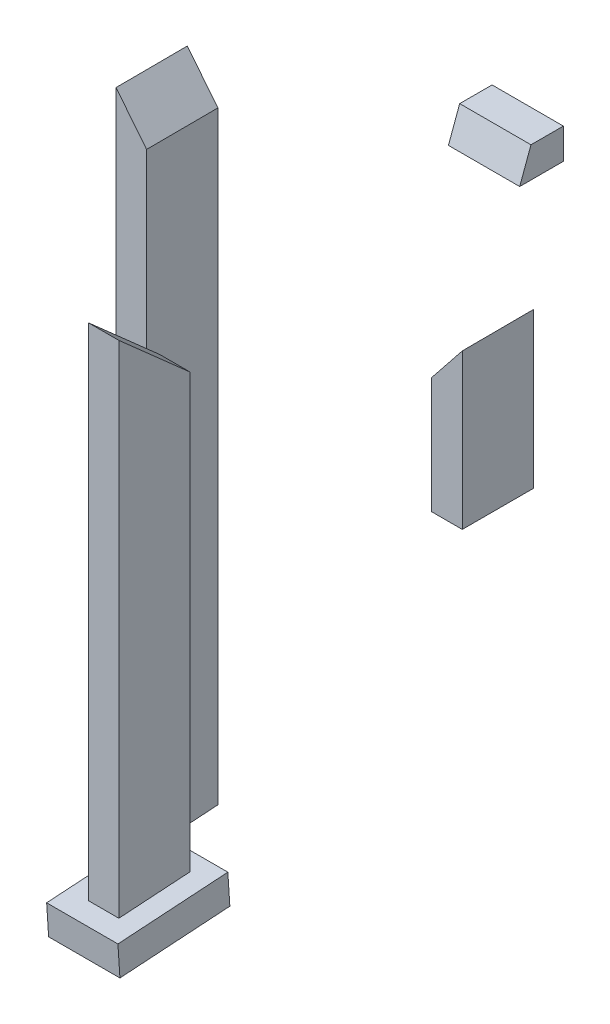
ISO-10303-21;
HEADER;
FILE_DESCRIPTION(('STEP AP214'),'2;1');
FILE_NAME('part.step','',(''),(''),'','','');
FILE_SCHEMA(('AUTOMOTIVE_DESIGN { 1 0 10303 214 1 1 1 1 }'));
ENDSEC;
DATA;
#1=APPLICATION_CONTEXT('core data for automotive mechanical design processes');
#2=APPLICATION_PROTOCOL_DEFINITION('international standard','automotive_design',2000,#1);
#3=PRODUCT_CONTEXT('',#1,'mechanical');
#4=PRODUCT('Part','Part','',(#3));
#5=PRODUCT_RELATED_PRODUCT_CATEGORY('part','',(#4));
#6=PRODUCT_DEFINITION_FORMATION('','',#4);
#7=PRODUCT_DEFINITION_CONTEXT('part definition',#1,'design');
#8=PRODUCT_DEFINITION('design','',#6,#7);
#9=PRODUCT_DEFINITION_SHAPE('','',#8);
#10=(LENGTH_UNIT() NAMED_UNIT(*) SI_UNIT(.MILLI.,.METRE.));
#11=(NAMED_UNIT(*) PLANE_ANGLE_UNIT() SI_UNIT($,.RADIAN.));
#12=(NAMED_UNIT(*) SI_UNIT($,.STERADIAN.) SOLID_ANGLE_UNIT());
#13=UNCERTAINTY_MEASURE_WITH_UNIT(LENGTH_MEASURE(1.E-05),#10,'distance_accuracy_value','');
#14=(GEOMETRIC_REPRESENTATION_CONTEXT(3) GLOBAL_UNCERTAINTY_ASSIGNED_CONTEXT((#13)) GLOBAL_UNIT_ASSIGNED_CONTEXT((#10,
#11,#12)) REPRESENTATION_CONTEXT('',''));
#15=CARTESIAN_POINT('',(0.,0.,0.));
#16=DIRECTION('',(0.,0.,1.));
#17=DIRECTION('',(1.,0.,0.));
#18=AXIS2_PLACEMENT_3D('',#15,#16,#17);
#19=CARTESIAN_POINT('',(-222.306656631324,200.54869689966,157.20965857934));
#20=DIRECTION('',(0.,0.,1.));
#21=DIRECTION('',(1.,0.,0.));
#22=AXIS2_PLACEMENT_3D('',#19,#20,#21);
#23=PLANE('',#22);
#24=DIRECTION('',(1.,0.,0.));
#25=VECTOR('',#24,1.);
#26=CARTESIAN_POINT('',(-2092.91633002723,-551.750667206393,157.20965857934));
#27=LINE('',#26,#25);
#28=CARTESIAN_POINT('',(-222.306656631323,-551.750667206399,157.209658579339));
#29=VERTEX_POINT('',#28);
#30=CARTESIAN_POINT('',(-184.206656631323,-551.7506672064,157.209658579339));
#31=VERTEX_POINT('',#30);
#32=EDGE_CURVE('E115',#29,#31,#27,.T.);
#33=ORIENTED_EDGE('',*,*,#32,.F.);
#34=DIRECTION('',(0.,-1.,0.));
#35=VECTOR('',#34,1.);
#36=CARTESIAN_POINT('',(-222.306656631324,200.54869689966,157.20965857934));
#37=LINE('',#36,#35);
#38=CARTESIAN_POINT('',(-222.306656631324,248.747832322276,157.20965857934));
#39=VERTEX_POINT('',#38);
#40=EDGE_CURVE('E183',#39,#29,#37,.T.);
#41=ORIENTED_EDGE('',*,*,#40,.F.);
#42=CARTESIAN_POINT('',(-222.306656631324,248.747832322276,157.20965857934));
#43=CARTESIAN_POINT('',(-215.956868036848,240.775979960126,157.209658579339));
#44=CARTESIAN_POINT('',(-209.606973739609,232.804211797568,157.209658579339));
#45=CARTESIAN_POINT('',(-196.906973739609,216.860843871637,157.209658579339));
#46=CARTESIAN_POINT('',(-190.556868036848,208.889244108264,157.209658579339));
#47=CARTESIAN_POINT('',(-184.206656631324,200.917728544482,157.209658579339));
#48=B_SPLINE_CURVE_WITH_KNOTS('',3,(#42,#43,#44,#45,#46,#47),.UNSPECIFIED.,.F.,.F.,(4,2,4),(0.,
30.575025871011,61.150051742022),.UNSPECIFIED.);
#49=CARTESIAN_POINT('',(-184.206656631324,200.917728544482,157.209658579339));
#50=VERTEX_POINT('',#49);
#51=EDGE_CURVE('E129',#39,#50,#48,.T.);
#52=ORIENTED_EDGE('',*,*,#51,.T.);
#53=DIRECTION('',(0.,-1.,0.));
#54=VECTOR('',#53,1.);
#55=CARTESIAN_POINT('',(-184.206656631324,200.54869689966,157.209658579339));
#56=LINE('',#55,#54);
#57=EDGE_CURVE('E166',#50,#31,#56,.T.);
#58=ORIENTED_EDGE('',*,*,#57,.T.);
#59=EDGE_LOOP('',(#33,#41,#52,#58));
#60=FACE_BOUND('',#59,.T.);
#61=ADVANCED_FACE('F68',(#60),#23,.F.);
#62=CARTESIAN_POINT('',(-34.9249999999667,31.4461867373069,256.590800000025));
#63=CARTESIAN_POINT('',(-34.9249999999667,31.4461867373069,205.079600000014));
#64=CARTESIAN_POINT('',(-34.9249999999667,31.4461867373069,153.568400000003));
#65=CARTESIAN_POINT('',(-34.9249999999667,31.4461867373069,102.057199999991));
#66=CARTESIAN_POINT('',(-123.161237840438,141.512853403974,349.089470571912));
#67=CARTESIAN_POINT('',(-122.942907620531,141.512853403974,263.762224842528));
#68=CARTESIAN_POINT('',(-122.724577400624,141.512853403974,178.434979113144));
#69=CARTESIAN_POINT('',(-122.506247180717,141.512853403974,93.1077333837597));
#70=CARTESIAN_POINT('',(-211.39747568091,251.57952007064,441.588141143798));
#71=CARTESIAN_POINT('',(-210.960815241096,251.57952007064,322.444849685041));
#72=CARTESIAN_POINT('',(-210.524154801282,251.57952007064,203.301558226285));
#73=CARTESIAN_POINT('',(-210.087494361468,251.57952007064,84.158266767528));
#74=CARTESIAN_POINT('',(-299.633713521381,361.646186737307,534.086811715685));
#75=CARTESIAN_POINT('',(-298.97872286166,361.646186737307,381.127474527555));
#76=CARTESIAN_POINT('',(-298.32373220194,361.646186737307,228.168137339426));
#77=CARTESIAN_POINT('',(-297.668741542219,361.646186737307,75.2088001512964));
#78=B_SPLINE_SURFACE_WITH_KNOTS('',3,3,((#62,#63,#64,#65),(#66,#67,#68,#69),(#70,#71,#72,#73),
(#74,#75,#76,#77)),.UNSPECIFIED.,.F.,.F.,.F.,(4,4),(4,4),(0.,1.),(0.,1.),.UNSPECIFIED.);
#79=OFFSET_SURFACE('',#78,11.1125,.F.);
#80=CARTESIAN_POINT('',(-184.206656631324,200.917728544482,157.209658579339));
#81=CARTESIAN_POINT('',(-184.206656631323,200.856161391934,172.026324986586));
#82=CARTESIAN_POINT('',(-184.206656631323,200.794625486928,186.842991523543));
#83=CARTESIAN_POINT('',(-184.206656631323,200.671616171997,216.476324856876));
#84=CARTESIAN_POINT('',(-184.206656631323,200.610142762073,231.292991653253));
#85=CARTESIAN_POINT('',(-184.206656631323,200.54870059969,246.109658579339));
#86=B_SPLINE_CURVE_WITH_KNOTS('',3,(#80,#81,#82,#83,#84,#85),.UNSPECIFIED.,.F.,.F.,(4,2,4),(0.,
44.4503829613964,88.9007659227928),.UNSPECIFIED.);
#87=CARTESIAN_POINT('',(-184.206656631323,200.54869689966,246.109658579339));
#88=VERTEX_POINT('',#87);
#89=EDGE_CURVE('E84',#50,#88,#86,.T.);
#90=ORIENTED_EDGE('',*,*,#89,.F.);
#91=ORIENTED_EDGE('',*,*,#51,.F.);
#92=CARTESIAN_POINT('',(-222.306656631323,248.33585439845,246.10965857934));
#93=CARTESIAN_POINT('',(-222.306656631323,248.404463499938,231.292991662957));
#94=CARTESIAN_POINT('',(-222.306656631323,248.473099544334,216.476324871432));
#95=CARTESIAN_POINT('',(-222.306656631323,248.610425518942,186.842991538099));
#96=CARTESIAN_POINT('',(-222.306656631324,248.679115449155,172.02632499629));
#97=CARTESIAN_POINT('',(-222.306656631324,248.747832322276,157.20965857934));
#98=B_SPLINE_CURVE_WITH_KNOTS('',3,(#92,#93,#94,#95,#96,#97),.UNSPECIFIED.,.F.,.F.,(4,2,4),(0.,
44.450477291689,88.9009545833781),.UNSPECIFIED.);
#99=CARTESIAN_POINT('',(-222.306656631323,248.33585439845,246.10965857934));
#100=VERTEX_POINT('',#99);
#101=EDGE_CURVE('E89',#100,#39,#98,.T.);
#102=ORIENTED_EDGE('',*,*,#101,.F.);
#103=CARTESIAN_POINT('',(-184.206656631323,200.54870059969,246.109658579339));
#104=CARTESIAN_POINT('',(-187.382011407271,204.530680547151,246.109658579339));
#105=CARTESIAN_POINT('',(-190.557265912773,208.512740451931,246.109658579339));
#106=CARTESIAN_POINT('',(-196.9075921368,216.477005996019,246.109658579339));
#107=CARTESIAN_POINT('',(-200.082663855326,220.459211635327,246.109658579339));
#108=CARTESIAN_POINT('',(-206.432642270092,228.423754481869,246.109658579339));
#109=CARTESIAN_POINT('',(-209.607548966333,232.406091689103,246.109658579339));
#110=CARTESIAN_POINT('',(-215.95721195245,240.370886021439,246.10965857934));
#111=CARTESIAN_POINT('',(-219.131968242326,244.35334314654,246.10965857934));
#112=CARTESIAN_POINT('',(-222.306656631323,248.33585439845,246.10965857934));
#113=B_SPLINE_CURVE_WITH_KNOTS('',3,(#103,#104,#105,#106,#107,#108,#109,#110,#111,#112),
.UNSPECIFIED.,.F.,.F.,(4,2,2,2,4),(0.,15.2791158185484,30.5582316105244,45.837347401201,
61.11646321845),.UNSPECIFIED.);
#114=EDGE_CURVE('E77',#88,#100,#113,.T.);
#115=ORIENTED_EDGE('',*,*,#114,.F.);
#116=EDGE_LOOP('',(#90,#91,#102,#115));
#117=FACE_BOUND('',#116,.T.);
#118=ADVANCED_FACE('F145',(#117),#79,.F.);
#119=CARTESIAN_POINT('',(-222.306656631323,200.54869689966,246.10965857934));
#120=DIRECTION('',(0.,0.,-1.));
#121=DIRECTION('',(-1.,0.,0.));
#122=AXIS2_PLACEMENT_3D('',#119,#120,#121);
#123=PLANE('',#122);
#124=DIRECTION('',(0.,-1.,0.));
#125=VECTOR('',#124,1.);
#126=CARTESIAN_POINT('',(-222.306656631323,200.54869689966,246.10965857934));
#127=LINE('',#126,#125);
#128=CARTESIAN_POINT('',(-222.306656631323,-557.574330308004,246.10965857934));
#129=VERTEX_POINT('',#128);
#130=EDGE_CURVE('E122',#100,#129,#127,.T.);
#131=ORIENTED_EDGE('',*,*,#130,.T.);
#132=DIRECTION('',(1.,0.,0.));
#133=VECTOR('',#132,1.);
#134=CARTESIAN_POINT('',(-222.306656631323,-557.574330308004,246.10965857934));
#135=LINE('',#134,#133);
#136=CARTESIAN_POINT('',(-184.206656631323,-557.574330308004,246.109658579339));
#137=VERTEX_POINT('',#136);
#138=EDGE_CURVE('E113',#129,#137,#135,.T.);
#139=ORIENTED_EDGE('',*,*,#138,.T.);
#140=DIRECTION('',(0.,-1.,0.));
#141=VECTOR('',#140,1.);
#142=CARTESIAN_POINT('',(-184.206656631323,200.54869689966,246.109658579339));
#143=LINE('',#142,#141);
#144=EDGE_CURVE('E119',#88,#137,#143,.T.);
#145=ORIENTED_EDGE('',*,*,#144,.F.);
#146=ORIENTED_EDGE('',*,*,#114,.T.);
#147=EDGE_LOOP('',(#131,#139,#145,#146));
#148=FACE_BOUND('',#147,.T.);
#149=ADVANCED_FACE('F70',(#148),#123,.F.);
#150=CARTESIAN_POINT('',(-184.206656631323,200.54869689966,246.109658579339));
#151=DIRECTION('',(-1.,0.,0.));
#152=DIRECTION('',(0.,0.,1.));
#153=AXIS2_PLACEMENT_3D('',#150,#151,#152);
#154=PLANE('',#153);
#155=ORIENTED_EDGE('',*,*,#144,.T.);
#156=DIRECTION('',(0.,0.0653679148444953,-0.997861230687355));
#157=VECTOR('',#156,1.);
#158=CARTESIAN_POINT('',(-184.206656631323,-554.334897684472,196.658727918077));
#159=LINE('',#158,#157);
#160=EDGE_CURVE('E109',#137,#31,#159,.T.);
#161=ORIENTED_EDGE('',*,*,#160,.T.);
#162=ORIENTED_EDGE('',*,*,#57,.F.);
#163=ORIENTED_EDGE('',*,*,#89,.T.);
#164=EDGE_LOOP('',(#155,#161,#162,#163));
#165=FACE_BOUND('',#164,.T.);
#166=ADVANCED_FACE('F120',(#165),#154,.F.);
#167=CARTESIAN_POINT('',(-222.306656631323,200.54869689966,246.10965857934));
#168=DIRECTION('',(1.,0.,0.));
#169=DIRECTION('',(0.,0.,-1.));
#170=AXIS2_PLACEMENT_3D('',#167,#168,#169);
#171=PLANE('',#170);
#172=ORIENTED_EDGE('',*,*,#40,.T.);
#173=DIRECTION('',(0.,-0.0653679148444953,0.997861230687355));
#174=VECTOR('',#173,1.);
#175=CARTESIAN_POINT('',(-222.306656631323,-554.334897684472,196.658727918077));
#176=LINE('',#175,#174);
#177=EDGE_CURVE('E13',#29,#129,#176,.T.);
#178=ORIENTED_EDGE('',*,*,#177,.T.);
#179=ORIENTED_EDGE('',*,*,#130,.F.);
#180=ORIENTED_EDGE('',*,*,#101,.T.);
#181=EDGE_LOOP('',(#172,#178,#179,#180));
#182=FACE_BOUND('',#181,.T.);
#183=ADVANCED_FACE('F168',(#182),#171,.F.);
#184=CARTESIAN_POINT('',(-2092.91633002723,-551.750667206393,157.20965857934));
#185=DIRECTION('',(0.,0.997861230687355,0.0653679148444953));
#186=DIRECTION('',(0.,-0.0653679148444953,0.997861230687355));
#187=AXIS2_PLACEMENT_3D('',#184,#185,#186);
#188=PLANE('',#187);
#189=ORIENTED_EDGE('',*,*,#160,.F.);
#190=ORIENTED_EDGE('',*,*,#138,.F.);
#191=ORIENTED_EDGE('',*,*,#177,.F.);
#192=ORIENTED_EDGE('',*,*,#32,.T.);
#193=EDGE_LOOP('',(#189,#190,#191,#192));
#194=FACE_BOUND('',#193,.T.);
#195=ADVANCED_FACE('F111',(#194),#188,.F.);
#196=CLOSED_SHELL('',(#61,#118,#149,#166,#183,#195));
#197=MANIFOLD_SOLID_BREP('B2',#196);
#198=CARTESIAN_POINT('',(252.903016686654,361.646186737307,-19.6341999999748));
#199=CARTESIAN_POINT('',(197.139240036872,251.57952007064,20.9296000000139));
#200=CARTESIAN_POINT('',(141.37546338709,141.512853403974,61.4934000000026));
#201=CARTESIAN_POINT('',(85.6116867373077,31.4461867373069,102.057199999991));
#202=CARTESIAN_POINT('',(101.196567808001,361.646186737307,-19.6341999999748));
#203=CARTESIAN_POINT('',(82.6086422580725,251.57952007064,20.9296000000139));
#204=CARTESIAN_POINT('',(64.0207167081444,141.512853403974,61.4934000000026));
#205=CARTESIAN_POINT('',(45.4327911582163,31.4461867373069,102.057199999991));
#206=CARTESIAN_POINT('',(-50.5098810706527,361.646186737307,-19.6341999999748));
#207=CARTESIAN_POINT('',(-31.9219555207268,251.57952007064,20.9296000000139));
#208=CARTESIAN_POINT('',(-13.334029970801,141.512853403974,61.4934000000026));
#209=CARTESIAN_POINT('',(5.25389557912479,31.4461867373069,102.057199999991));
#210=CARTESIAN_POINT('',(-202.216329949306,361.646186737307,-19.6341999999748));
#211=CARTESIAN_POINT('',(-146.452553299526,251.57952007064,20.9296000000139));
#212=CARTESIAN_POINT('',(-90.6887766497464,141.512853403974,61.4934000000027));
#213=CARTESIAN_POINT('',(-34.9249999999667,31.4461867373069,102.057199999991));
#214=B_SPLINE_SURFACE_WITH_KNOTS('',3,3,((#198,#199,#200,#201),(#202,#203,#204,#205),(#206,#207,
#208,#209),(#210,#211,#212,#213)),.UNSPECIFIED.,.F.,.F.,.F.,(4,4),(4,4),(0.,1.),(0.,1.),.UNSPECIFIED.);
#215=OFFSET_SURFACE('',#214,-11.1125,.F.);
#216=CARTESIAN_POINT('',(-19.1066566313261,219.904002665549,20.7601124284216));
#217=CARTESIAN_POINT('',(-19.1066566313261,207.204002665549,25.4405508899587));
#218=CARTESIAN_POINT('',(-19.1066566313261,194.504002665549,30.1209893514959));
#219=CARTESIAN_POINT('',(-19.1066566313261,181.804002665549,34.8014278130331));
#220=B_SPLINE_CURVE_WITH_KNOTS('',3,(#216,#217,#218,#219),.UNSPECIFIED.,.F.,.F.,(4,4),(0.,
40.6050309411301),.UNSPECIFIED.);
#221=CARTESIAN_POINT('',(-19.1066566313261,219.904002665549,20.7601124284216));
#222=VERTEX_POINT('',#221);
#223=CARTESIAN_POINT('',(-19.1066566313261,181.804002665549,34.8014278130331));
#224=VERTEX_POINT('',#223);
#225=EDGE_CURVE('E260',#222,#224,#220,.T.);
#226=ORIENTED_EDGE('',*,*,#225,.T.);
#227=CARTESIAN_POINT('',(-19.1066566313262,181.804002665549,34.8014278130331));
#228=CARTESIAN_POINT('',(10.5266767020074,181.804002665549,34.8014278130331));
#229=CARTESIAN_POINT('',(40.1600100353409,181.804002665549,34.8014278130331));
#230=CARTESIAN_POINT('',(69.7933433686745,181.804002665549,34.8014278130331));
#231=B_SPLINE_CURVE_WITH_KNOTS('',3,(#227,#228,#229,#230),.UNSPECIFIED.,.F.,.F.,(4,4),(0.,
88.9000000000008),.UNSPECIFIED.);
#232=CARTESIAN_POINT('',(69.7933433686745,181.804002665549,34.8014278130331));
#233=VERTEX_POINT('',#232);
#234=EDGE_CURVE('E66',#224,#233,#231,.T.);
#235=ORIENTED_EDGE('',*,*,#234,.T.);
#236=CARTESIAN_POINT('',(69.7933433686739,181.804002665549,34.8014278130331));
#237=CARTESIAN_POINT('',(69.7933433686739,194.504002665549,30.1209893514959));
#238=CARTESIAN_POINT('',(69.7933433686739,207.204002665549,25.4405508899588));
#239=CARTESIAN_POINT('',(69.7933433686739,219.904002665549,20.7601124284216));
#240=B_SPLINE_CURVE_WITH_KNOTS('',3,(#236,#237,#238,#239),.UNSPECIFIED.,.F.,.F.,(4,4),(0.,
40.6050309411301),.UNSPECIFIED.);
#241=CARTESIAN_POINT('',(69.7933433686739,219.904002665549,20.7601124284216));
#242=VERTEX_POINT('',#241);
#243=EDGE_CURVE('E297',#233,#242,#240,.T.);
#244=ORIENTED_EDGE('',*,*,#243,.T.);
#245=CARTESIAN_POINT('',(69.7933433686745,219.904002665549,20.7601124284216));
#246=CARTESIAN_POINT('',(40.160010035341,219.904002665549,20.7601124284216));
#247=CARTESIAN_POINT('',(10.5266767020074,219.904002665549,20.7601124284216));
#248=CARTESIAN_POINT('',(-19.1066566313262,219.904002665549,20.7601124284216));
#249=B_SPLINE_CURVE_WITH_KNOTS('',3,(#245,#246,#247,#248),.UNSPECIFIED.,.F.,.F.,(4,4),(0.,
88.9000000000008),.UNSPECIFIED.);
#250=EDGE_CURVE('E303',#242,#222,#249,.T.);
#251=ORIENTED_EDGE('',*,*,#250,.T.);
#252=EDGE_LOOP('',(#226,#235,#244,#251));
#253=FACE_BOUND('',#252,.T.);
#254=ADVANCED_FACE('F245',(#253),#215,.T.);
#255=CARTESIAN_POINT('',(-19.1066566313261,181.804002665549,-19.6341999999748));
#256=DIRECTION('',(0.,1.,0.));
#257=DIRECTION('',(0.,0.,1.));
#258=AXIS2_PLACEMENT_3D('',#255,#256,#257);
#259=PLANE('',#258);
#260=DIRECTION('',(0.,0.,1.));
#261=VECTOR('',#260,1.);
#262=CARTESIAN_POINT('',(-19.1066566313261,181.804002665549,-19.6341999999748));
#263=LINE('',#262,#261);
#264=CARTESIAN_POINT('',(-19.1066566313261,181.804002665549,-19.6341999999748));
#265=VERTEX_POINT('',#264);
#266=EDGE_CURVE('E274',#265,#224,#263,.T.);
#267=ORIENTED_EDGE('',*,*,#266,.F.);
#268=DIRECTION('',(-1.,0.,0.));
#269=VECTOR('',#268,1.);
#270=CARTESIAN_POINT('',(-19.1066566313261,181.804002665549,-19.6341999999748));
#271=LINE('',#270,#269);
#272=CARTESIAN_POINT('',(69.7933433686739,181.804002665549,-19.6341999999748));
#273=VERTEX_POINT('',#272);
#274=EDGE_CURVE('E299',#273,#265,#271,.T.);
#275=ORIENTED_EDGE('',*,*,#274,.F.);
#276=DIRECTION('',(0.,0.,1.));
#277=VECTOR('',#276,1.);
#278=CARTESIAN_POINT('',(69.7933433686739,181.804002665549,-19.6341999999748));
#279=LINE('',#278,#277);
#280=EDGE_CURVE('E267',#273,#233,#279,.T.);
#281=ORIENTED_EDGE('',*,*,#280,.T.);
#282=ORIENTED_EDGE('',*,*,#234,.F.);
#283=EDGE_LOOP('',(#267,#275,#281,#282));
#284=FACE_BOUND('',#283,.T.);
#285=ADVANCED_FACE('F300',(#284),#259,.F.);
#286=CARTESIAN_POINT('',(69.7933433686739,181.804002665549,-19.6341999999748));
#287=DIRECTION('',(-1.,0.,0.));
#288=DIRECTION('',(0.,0.,1.));
#289=AXIS2_PLACEMENT_3D('',#286,#287,#288);
#290=PLANE('',#289);
#291=ORIENTED_EDGE('',*,*,#280,.F.);
#292=DIRECTION('',(0.,-1.,0.));
#293=VECTOR('',#292,1.);
#294=CARTESIAN_POINT('',(69.7933433686739,181.804002665549,-19.6341999999748));
#295=LINE('',#294,#293);
#296=CARTESIAN_POINT('',(69.7933433686739,219.904002665549,-19.6341999999748));
#297=VERTEX_POINT('',#296);
#298=EDGE_CURVE('E295',#297,#273,#295,.T.);
#299=ORIENTED_EDGE('',*,*,#298,.F.);
#300=DIRECTION('',(0.,0.,1.));
#301=VECTOR('',#300,1.);
#302=CARTESIAN_POINT('',(69.7933433686739,219.904002665549,-19.6341999999748));
#303=LINE('',#302,#301);
#304=EDGE_CURVE('E314',#297,#242,#303,.T.);
#305=ORIENTED_EDGE('',*,*,#304,.T.);
#306=ORIENTED_EDGE('',*,*,#243,.F.);
#307=EDGE_LOOP('',(#291,#299,#305,#306));
#308=FACE_BOUND('',#307,.T.);
#309=ADVANCED_FACE('F292',(#308),#290,.F.);
#310=CARTESIAN_POINT('',(-19.1066566313261,181.804002665549,-19.6341999999748));
#311=DIRECTION('',(1.,0.,0.));
#312=DIRECTION('',(0.,1.,0.));
#313=AXIS2_PLACEMENT_3D('',#310,#311,#312);
#314=PLANE('',#313);
#315=ORIENTED_EDGE('',*,*,#225,.F.);
#316=DIRECTION('',(0.,0.,1.));
#317=VECTOR('',#316,1.);
#318=CARTESIAN_POINT('',(-19.1066566313261,219.904002665549,-19.6341999999748));
#319=LINE('',#318,#317);
#320=CARTESIAN_POINT('',(-19.1066566313261,219.904002665549,-19.6341999999748));
#321=VERTEX_POINT('',#320);
#322=EDGE_CURVE('E316',#321,#222,#319,.T.);
#323=ORIENTED_EDGE('',*,*,#322,.F.);
#324=DIRECTION('',(0.,1.,0.));
#325=VECTOR('',#324,1.);
#326=CARTESIAN_POINT('',(-19.1066566313261,181.804002665549,-19.6341999999748));
#327=LINE('',#326,#325);
#328=EDGE_CURVE('E309',#265,#321,#327,.T.);
#329=ORIENTED_EDGE('',*,*,#328,.F.);
#330=ORIENTED_EDGE('',*,*,#266,.T.);
#331=EDGE_LOOP('',(#315,#323,#329,#330));
#332=FACE_BOUND('',#331,.T.);
#333=ADVANCED_FACE('F247',(#332),#314,.F.);
#334=CARTESIAN_POINT('',(0.,0.,-19.6341999999748));
#335=DIRECTION('',(0.,0.,-1.));
#336=DIRECTION('',(-1.,0.,0.));
#337=AXIS2_PLACEMENT_3D('',#334,#335,#336);
#338=PLANE('',#337);
#339=ORIENTED_EDGE('',*,*,#328,.T.);
#340=DIRECTION('',(1.,0.,0.));
#341=VECTOR('',#340,1.);
#342=CARTESIAN_POINT('',(-19.1066566313261,219.904002665549,-19.6341999999748));
#343=LINE('',#342,#341);
#344=EDGE_CURVE('E307',#321,#297,#343,.T.);
#345=ORIENTED_EDGE('',*,*,#344,.T.);
#346=ORIENTED_EDGE('',*,*,#298,.T.);
#347=ORIENTED_EDGE('',*,*,#274,.T.);
#348=EDGE_LOOP('',(#339,#345,#346,#347));
#349=FACE_BOUND('',#348,.T.);
#350=ADVANCED_FACE('F306',(#349),#338,.T.);
#351=CARTESIAN_POINT('',(-19.1066566313261,219.904002665549,-19.6341999999748));
#352=DIRECTION('',(0.,-1.,0.));
#353=DIRECTION('',(0.,0.,-1.));
#354=AXIS2_PLACEMENT_3D('',#351,#352,#353);
#355=PLANE('',#354);
#356=ORIENTED_EDGE('',*,*,#344,.F.);
#357=ORIENTED_EDGE('',*,*,#322,.T.);
#358=ORIENTED_EDGE('',*,*,#250,.F.);
#359=ORIENTED_EDGE('',*,*,#304,.F.);
#360=EDGE_LOOP('',(#356,#357,#358,#359));
#361=FACE_BOUND('',#360,.T.);
#362=ADVANCED_FACE('F347',(#361),#355,.F.);
#363=CLOSED_SHELL('',(#254,#285,#309,#333,#350,#362));
#364=MANIFOLD_SOLID_BREP('B7',#363);
#365=CARTESIAN_POINT('',(85.6116867373077,31.4461867373069,256.590800000025));
#366=CARTESIAN_POINT('',(85.6116867373077,31.4461867373069,205.079600000014));
#367=CARTESIAN_POINT('',(85.6116867373077,31.4461867373069,153.568400000003));
#368=CARTESIAN_POINT('',(85.6116867373077,31.4461867373069,102.057199999991));
#369=CARTESIAN_POINT('',(173.847924577782,141.512853403974,349.089470571912));
#370=CARTESIAN_POINT('',(173.629594357875,141.512853403974,263.762224842528));
#371=CARTESIAN_POINT('',(173.411264137968,141.512853403974,178.434979113144));
#372=CARTESIAN_POINT('',(173.192933918061,141.512853403974,93.1077333837597));
#373=CARTESIAN_POINT('',(262.084162418256,251.57952007064,441.588141143798));
#374=CARTESIAN_POINT('',(261.647501978442,251.57952007064,322.444849685041));
#375=CARTESIAN_POINT('',(261.210841538628,251.57952007064,203.301558226285));
#376=CARTESIAN_POINT('',(260.774181098814,251.57952007064,84.158266767528));
#377=CARTESIAN_POINT('',(350.320400258729,361.646186737307,534.086811715685));
#378=CARTESIAN_POINT('',(349.665409599009,361.646186737307,381.127474527555));
#379=CARTESIAN_POINT('',(349.010418939288,361.646186737307,228.168137339426));
#380=CARTESIAN_POINT('',(348.355428279567,361.646186737307,75.2088001512963));
#381=B_SPLINE_SURFACE_WITH_KNOTS('',3,3,((#365,#366,#367,#368),(#369,#370,#371,#372),(#373,#374,
#375,#376),(#377,#378,#379,#380)),.UNSPECIFIED.,.F.,.F.,.F.,(4,4),(4,4),(0.,1.),(0.,1.),.UNSPECIFIED.);
#382=OFFSET_SURFACE('',#381,-11.1125,.F.);
#383=CARTESIAN_POINT('',(253.943358182125,224.244581573542,290.555904464682));
#384=CARTESIAN_POINT('',(253.943358182125,224.309781460416,275.739237542111));
#385=CARTESIAN_POINT('',(253.943358182125,224.375010398489,260.922570747493));
#386=CARTESIAN_POINT('',(253.943358182125,224.50552637703,231.289237414159));
#387=CARTESIAN_POINT('',(253.943358182125,224.570813417499,216.472570875445));
#388=CARTESIAN_POINT('',(253.943358182125,224.636129509166,201.655904464682));
#389=B_SPLINE_CURVE_WITH_KNOTS('',3,(#383,#384,#385,#386,#387,#388),.UNSPECIFIED.,.F.,.F.,(4,2,
4),(0.,44.4504311278762,88.9008622557524),.UNSPECIFIED.);
#390=CARTESIAN_POINT('',(253.943358182125,224.244581573542,290.555904464682));
#391=VERTEX_POINT('',#390);
#392=CARTESIAN_POINT('',(253.943358182126,224.636129509166,201.655904464682));
#393=VERTEX_POINT('',#392);
#394=EDGE_CURVE('E434',#391,#393,#389,.T.);
#395=ORIENTED_EDGE('',*,*,#394,.T.);
#396=CARTESIAN_POINT('',(253.943358182126,224.636129509166,201.655904464682));
#397=CARTESIAN_POINT('',(250.76860835943,220.652375778616,201.655904464682));
#398=CARTESIAN_POINT('',(247.593804572842,216.668665052599,201.655904464682));
#399=CARTESIAN_POINT('',(241.244076567446,208.701339589024,201.655904464682));
#400=CARTESIAN_POINT('',(238.06915234864,204.717724851466,201.655904464682));
#401=CARTESIAN_POINT('',(231.719170967013,196.750601334964,201.655904464682));
#402=CARTESIAN_POINT('',(228.544113804192,192.767092556021,201.655904464682));
#403=CARTESIAN_POINT('',(222.193851116979,184.800193247092,201.655904464682));
#404=CARTESIAN_POINT('',(219.018645592587,180.816802717107,201.655904464682));
#405=CARTESIAN_POINT('',(215.843358182126,176.833477461157,201.655904464682));
#406=B_SPLINE_CURVE_WITH_KNOTS('',3,(#396,#397,#398,#399,#400,#401,#402,#403,#404,#405),
.UNSPECIFIED.,.F.,.F.,(4,2,2,2,4),(0.,15.2821455302468,30.5642910432239,45.8464365571047,
61.1285820882552),.UNSPECIFIED.);
#407=CARTESIAN_POINT('',(215.843358182126,176.833477461157,201.655904464682));
#408=VERTEX_POINT('',#407);
#409=EDGE_CURVE('E243',#393,#408,#406,.T.);
#410=ORIENTED_EDGE('',*,*,#409,.T.);
#411=CARTESIAN_POINT('',(215.843358182126,176.833477461157,201.655904464682));
#412=CARTESIAN_POINT('',(215.843358182125,176.776352405739,216.472570873645));
#413=CARTESIAN_POINT('',(215.843358182125,176.719260810153,231.28923741146));
#414=CARTESIAN_POINT('',(215.843358182125,176.605144538642,260.922570744793));
#415=CARTESIAN_POINT('',(215.843358182125,176.548119862718,275.739237540311));
#416=CARTESIAN_POINT('',(215.843358182125,176.491128646625,290.555904464682));
#417=B_SPLINE_CURVE_WITH_KNOTS('',3,(#411,#412,#413,#414,#415,#416),.UNSPECIFIED.,.F.,.F.,(4,2,
4),(0.,44.4503295903168,88.9006591806334),.UNSPECIFIED.);
#418=CARTESIAN_POINT('',(215.843358182125,176.491128646626,290.555904464682));
#419=VERTEX_POINT('',#418);
#420=EDGE_CURVE('E476',#408,#419,#417,.T.);
#421=ORIENTED_EDGE('',*,*,#420,.T.);
#422=CARTESIAN_POINT('',(215.843358182125,176.491128646625,290.555904464682));
#423=CARTESIAN_POINT('',(219.018942884543,180.47011652236,290.555904464682));
#424=CARTESIAN_POINT('',(222.19436102202,184.449237327412,290.555904464682));
#425=CARTESIAN_POINT('',(228.544895476358,192.4077197478,290.555904464682));
#426=CARTESIAN_POINT('',(231.720011793222,196.387081363135,290.555904464682));
#427=CARTESIAN_POINT('',(238.069973944593,204.346020392066,290.555904464682));
#428=CARTESIAN_POINT('',(241.2448197791,208.325597805662,290.555904464682));
#429=CARTESIAN_POINT('',(247.594266407887,216.284948140795,290.555904464682));
#430=CARTESIAN_POINT('',(250.768867202166,220.264721062333,290.555904464682));
#431=CARTESIAN_POINT('',(253.943358182125,224.244581573542,290.555904464682));
#432=B_SPLINE_CURVE_WITH_KNOTS('',3,(#422,#423,#424,#425,#426,#427,#428,#429,#430,#431),
.UNSPECIFIED.,.F.,.F.,(4,2,2,2,4),(0.,15.2725290693702,30.5450580671539,45.8175870611944,
61.0901161268213),.UNSPECIFIED.);
#433=EDGE_CURVE('E471',#419,#391,#432,.T.);
#434=ORIENTED_EDGE('',*,*,#433,.T.);
#435=EDGE_LOOP('',(#395,#410,#421,#434));
#436=FACE_BOUND('',#435,.T.);
#437=ADVANCED_FACE('F424',(#436),#382,.T.);
#438=CARTESIAN_POINT('',(215.843358182125,31.4461867373068,290.555904464682));
#439=DIRECTION('',(0.,0.,-1.));
#440=DIRECTION('',(-1.,0.,0.));
#441=AXIS2_PLACEMENT_3D('',#438,#439,#440);
#442=PLANE('',#441);
#443=ORIENTED_EDGE('',*,*,#433,.F.);
#444=DIRECTION('',(0.,1.,0.));
#445=VECTOR('',#444,1.);
#446=CARTESIAN_POINT('',(215.843358182125,31.4461867373068,290.555904464682));
#447=LINE('',#446,#445);
#448=CARTESIAN_POINT('',(215.843358182125,31.4461867373068,290.555904464682));
#449=VERTEX_POINT('',#448);
#450=EDGE_CURVE('E465',#449,#419,#447,.T.);
#451=ORIENTED_EDGE('',*,*,#450,.F.);
#452=DIRECTION('',(-1.,0.,0.));
#453=VECTOR('',#452,1.);
#454=CARTESIAN_POINT('',(215.843358182125,31.4461867373068,290.555904464682));
#455=LINE('',#454,#453);
#456=CARTESIAN_POINT('',(253.943358182125,31.4461867373068,290.555904464682));
#457=VERTEX_POINT('',#456);
#458=EDGE_CURVE('E469',#457,#449,#455,.T.);
#459=ORIENTED_EDGE('',*,*,#458,.F.);
#460=DIRECTION('',(0.,1.,0.));
#461=VECTOR('',#460,1.);
#462=CARTESIAN_POINT('',(253.943358182125,31.4461867373068,290.555904464682));
#463=LINE('',#462,#461);
#464=EDGE_CURVE('E449',#457,#391,#463,.T.);
#465=ORIENTED_EDGE('',*,*,#464,.T.);
#466=EDGE_LOOP('',(#443,#451,#459,#465));
#467=FACE_BOUND('',#466,.T.);
#468=ADVANCED_FACE('F467',(#467),#442,.F.);
#469=CARTESIAN_POINT('',(253.943358182126,31.4461867373068,201.655904464682));
#470=DIRECTION('',(-1.,0.,0.));
#471=DIRECTION('',(0.,0.,1.));
#472=AXIS2_PLACEMENT_3D('',#469,#470,#471);
#473=PLANE('',#472);
#474=ORIENTED_EDGE('',*,*,#464,.F.);
#475=DIRECTION('',(0.,0.,1.));
#476=VECTOR('',#475,1.);
#477=CARTESIAN_POINT('',(253.943358182126,31.4461867373068,201.655904464682));
#478=LINE('',#477,#476);
#479=CARTESIAN_POINT('',(253.943358182126,31.4461867373068,201.655904464682));
#480=VERTEX_POINT('',#479);
#481=EDGE_CURVE('E487',#480,#457,#478,.T.);
#482=ORIENTED_EDGE('',*,*,#481,.F.);
#483=DIRECTION('',(0.,1.,0.));
#484=VECTOR('',#483,1.);
#485=CARTESIAN_POINT('',(253.943358182126,31.4461867373068,201.655904464682));
#486=LINE('',#485,#484);
#487=EDGE_CURVE('E429',#480,#393,#486,.T.);
#488=ORIENTED_EDGE('',*,*,#487,.T.);
#489=ORIENTED_EDGE('',*,*,#394,.F.);
#490=EDGE_LOOP('',(#474,#482,#488,#489));
#491=FACE_BOUND('',#490,.T.);
#492=ADVANCED_FACE('F535',(#491),#473,.F.);
#493=CARTESIAN_POINT('',(215.843358182126,31.4461867373068,201.655904464682));
#494=DIRECTION('',(0.,0.,1.));
#495=DIRECTION('',(1.,0.,0.));
#496=AXIS2_PLACEMENT_3D('',#493,#494,#495);
#497=PLANE('',#496);
#498=ORIENTED_EDGE('',*,*,#487,.F.);
#499=DIRECTION('',(1.,0.,0.));
#500=VECTOR('',#499,1.);
#501=CARTESIAN_POINT('',(215.843358182126,31.4461867373068,201.655904464682));
#502=LINE('',#501,#500);
#503=CARTESIAN_POINT('',(215.843358182126,31.4461867373068,201.655904464682));
#504=VERTEX_POINT('',#503);
#505=EDGE_CURVE('E489',#504,#480,#502,.T.);
#506=ORIENTED_EDGE('',*,*,#505,.F.);
#507=DIRECTION('',(0.,1.,0.));
#508=VECTOR('',#507,1.);
#509=CARTESIAN_POINT('',(215.843358182126,31.4461867373068,201.655904464682));
#510=LINE('',#509,#508);
#511=EDGE_CURVE('E475',#504,#408,#510,.T.);
#512=ORIENTED_EDGE('',*,*,#511,.T.);
#513=ORIENTED_EDGE('',*,*,#409,.F.);
#514=EDGE_LOOP('',(#498,#506,#512,#513));
#515=FACE_BOUND('',#514,.T.);
#516=ADVANCED_FACE('F426',(#515),#497,.F.);
#517=CARTESIAN_POINT('',(34.0393555165767,31.4461867373068,220.762561096007));
#518=DIRECTION('',(0.,-1.,0.));
#519=DIRECTION('',(0.,0.,-1.));
#520=AXIS2_PLACEMENT_3D('',#517,#518,#519);
#521=PLANE('',#520);
#522=ORIENTED_EDGE('',*,*,#505,.T.);
#523=ORIENTED_EDGE('',*,*,#481,.T.);
#524=ORIENTED_EDGE('',*,*,#458,.T.);
#525=DIRECTION('',(0.,0.,-1.));
#526=VECTOR('',#525,1.);
#527=CARTESIAN_POINT('',(215.843358182126,31.4461867373068,201.655904464682));
#528=LINE('',#527,#526);
#529=EDGE_CURVE('E479',#449,#504,#528,.T.);
#530=ORIENTED_EDGE('',*,*,#529,.T.);
#531=EDGE_LOOP('',(#522,#523,#524,#530));
#532=FACE_BOUND('',#531,.T.);
#533=ADVANCED_FACE('F486',(#532),#521,.T.);
#534=CARTESIAN_POINT('',(215.843358182126,31.4461867373068,201.655904464682));
#535=DIRECTION('',(1.,0.,0.));
#536=DIRECTION('',(0.,0.,-1.));
#537=AXIS2_PLACEMENT_3D('',#534,#535,#536);
#538=PLANE('',#537);
#539=ORIENTED_EDGE('',*,*,#529,.F.);
#540=ORIENTED_EDGE('',*,*,#450,.T.);
#541=ORIENTED_EDGE('',*,*,#420,.F.);
#542=ORIENTED_EDGE('',*,*,#511,.F.);
#543=EDGE_LOOP('',(#539,#540,#541,#542));
#544=FACE_BOUND('',#543,.T.);
#545=ADVANCED_FACE('F480',(#544),#538,.F.);
#546=CLOSED_SHELL('',(#437,#468,#492,#516,#533,#545));
#547=MANIFOLD_SOLID_BREP('B60',#546);
#548=CARTESIAN_POINT('',(85.6116867373077,31.4461867373069,256.590800000025));
#549=CARTESIAN_POINT('',(45.4327911582162,31.4461867373069,256.590800000025));
#550=CARTESIAN_POINT('',(5.25389557912473,31.446186737307,256.590800000025));
#551=CARTESIAN_POINT('',(-34.9249999999668,31.446186737307,256.590800000025));
#552=CARTESIAN_POINT('',(142.302373849792,141.512853403974,380.976306578898));
#553=CARTESIAN_POINT('',(64.3296868623783,141.512853403974,380.976306578898));
#554=CARTESIAN_POINT('',(-13.643000125035,141.512853403974,380.976306578898));
#555=CARTESIAN_POINT('',(-91.6156871124483,141.512853403974,380.976306578898));
#556=CARTESIAN_POINT('',(198.993060962276,251.57952007064,505.36181315777));
#557=CARTESIAN_POINT('',(83.2265825665404,251.57952007064,505.36181315777));
#558=CARTESIAN_POINT('',(-32.5398958291947,251.57952007064,505.36181315777));
#559=CARTESIAN_POINT('',(-148.30637422493,251.57952007064,505.36181315777));
#560=CARTESIAN_POINT('',(255.683748074759,361.646186737307,629.747319736643));
#561=CARTESIAN_POINT('',(102.123478270702,361.646186737307,629.747319736643));
#562=CARTESIAN_POINT('',(-51.4367915333544,361.646186737307,629.747319736643));
#563=CARTESIAN_POINT('',(-204.997061337411,361.646186737307,629.747319736643));
#564=B_SPLINE_SURFACE_WITH_KNOTS('',3,3,((#548,#549,#550,#551),(#552,#553,#554,#555),(#556,#557,
#558,#559),(#560,#561,#562,#563)),.UNSPECIFIED.,.F.,.F.,.F.,(4,4),(4,4),(0.,1.),(0.,1.),.UNSPECIFIED.);
#565=OFFSET_SURFACE('',#564,11.1125,.F.);
#566=CARTESIAN_POINT('',(44.3933433686742,161.520936716816,420.356155244655));
#567=CARTESIAN_POINT('',(44.3933433686741,187.742980682638,449.989488577989));
#568=CARTESIAN_POINT('',(44.393343368674,213.96502464846,479.622821911322));
#569=CARTESIAN_POINT('',(44.3933433686739,240.187068614281,509.256155244655));
#570=B_SPLINE_CURVE_WITH_KNOTS('',3,(#566,#567,#568,#569),.UNSPECIFIED.,.F.,.F.,(4,4),(0.,
118.707920155773),.UNSPECIFIED.);
#571=CARTESIAN_POINT('',(44.3933433686742,161.520936716816,420.356155244655));
#572=VERTEX_POINT('',#571);
#573=CARTESIAN_POINT('',(44.3933433686739,240.187068614281,509.256155244655));
#574=VERTEX_POINT('',#573);
#575=EDGE_CURVE('E661',#572,#574,#570,.T.);
#576=ORIENTED_EDGE('',*,*,#575,.F.);
#577=CARTESIAN_POINT('',(6.29334336867405,161.520936716816,420.356155244655));
#578=CARTESIAN_POINT('',(18.9933433686741,161.520936716816,420.356155244655));
#579=CARTESIAN_POINT('',(31.6933433686742,161.520936716816,420.356155244655));
#580=CARTESIAN_POINT('',(44.3933433686742,161.520936716816,420.356155244655));
#581=B_SPLINE_CURVE_WITH_KNOTS('',3,(#577,#578,#579,#580),.UNSPECIFIED.,.F.,.F.,(4,4),(0.,
38.1000000000002),.UNSPECIFIED.);
#582=CARTESIAN_POINT('',(6.29334336867405,161.520936716816,420.356155244655));
#583=VERTEX_POINT('',#582);
#584=EDGE_CURVE('E646',#583,#572,#581,.T.);
#585=ORIENTED_EDGE('',*,*,#584,.F.);
#586=CARTESIAN_POINT('',(6.29334336867385,240.187068614282,509.256155244655));
#587=CARTESIAN_POINT('',(6.29334336867396,213.96502464846,479.622821911322));
#588=CARTESIAN_POINT('',(6.29334336867407,187.742980682638,449.989488577989));
#589=CARTESIAN_POINT('',(6.29334336867417,161.520936716816,420.356155244655));
#590=B_SPLINE_CURVE_WITH_KNOTS('',3,(#586,#587,#588,#589),.UNSPECIFIED.,.F.,.F.,(4,4),(0.,
118.707920155773),.UNSPECIFIED.);
#591=CARTESIAN_POINT('',(6.29334336867385,240.187068614282,509.256155244655));
#592=VERTEX_POINT('',#591);
#593=EDGE_CURVE('E422',#592,#583,#590,.T.);
#594=ORIENTED_EDGE('',*,*,#593,.F.);
#595=CARTESIAN_POINT('',(44.3933433686739,240.187068614282,509.256155244655));
#596=CARTESIAN_POINT('',(31.6933433686739,240.187068614282,509.256155244655));
#597=CARTESIAN_POINT('',(18.9933433686738,240.187068614282,509.256155244655));
#598=CARTESIAN_POINT('',(6.29334336867376,240.187068614282,509.256155244656));
#599=B_SPLINE_CURVE_WITH_KNOTS('',3,(#595,#596,#597,#598),.UNSPECIFIED.,.F.,.F.,(4,4),(0.,
38.1000000000001),.UNSPECIFIED.);
#600=EDGE_CURVE('E676',#574,#592,#599,.T.);
#601=ORIENTED_EDGE('',*,*,#600,.F.);
#602=EDGE_LOOP('',(#576,#585,#594,#601));
#603=FACE_BOUND('',#602,.T.);
#604=ADVANCED_FACE('F602',(#603),#565,.F.);
#605=CARTESIAN_POINT('',(6.29334336867416,-419.174058023587,420.356155244655));
#606=DIRECTION('',(1.,0.,0.));
#607=DIRECTION('',(0.,0.,-1.));
#608=AXIS2_PLACEMENT_3D('',#605,#606,#607);
#609=PLANE('',#608);
#610=ORIENTED_EDGE('',*,*,#593,.T.);
#611=DIRECTION('',(0.,1.,0.));
#612=VECTOR('',#611,1.);
#613=CARTESIAN_POINT('',(6.29334336867416,-419.174058023587,420.356155244655));
#614=LINE('',#613,#612);
#615=CARTESIAN_POINT('',(6.29334336867416,-378.080564706292,420.356155244655));
#616=VERTEX_POINT('',#615);
#617=EDGE_CURVE('E637',#616,#583,#614,.T.);
#618=ORIENTED_EDGE('',*,*,#617,.F.);
#619=DIRECTION('',(0.,0.065367914844494,-0.997861230687355));
#620=VECTOR('',#619,1.);
#621=CARTESIAN_POINT('',(6.29334336867415,-378.256155735835,423.036606062971));
#622=LINE('',#621,#620);
#623=CARTESIAN_POINT('',(6.29334336867385,-383.904227807897,509.256155244655));
#624=VERTEX_POINT('',#623);
#625=EDGE_CURVE('E641',#624,#616,#622,.T.);
#626=ORIENTED_EDGE('',*,*,#625,.F.);
#627=DIRECTION('',(0.,1.,0.));
#628=VECTOR('',#627,1.);
#629=CARTESIAN_POINT('',(6.29334336867385,-419.174058023587,509.256155244655));
#630=LINE('',#629,#628);
#631=EDGE_CURVE('E607',#624,#592,#630,.T.);
#632=ORIENTED_EDGE('',*,*,#631,.T.);
#633=EDGE_LOOP('',(#610,#618,#626,#632));
#634=FACE_BOUND('',#633,.T.);
#635=ADVANCED_FACE('F639',(#634),#609,.F.);
#636=CARTESIAN_POINT('',(6.29334336867385,-419.174058023587,509.256155244655));
#637=DIRECTION('',(0.,0.,-1.));
#638=DIRECTION('',(-1.,0.,0.));
#639=AXIS2_PLACEMENT_3D('',#636,#637,#638);
#640=PLANE('',#639);
#641=ORIENTED_EDGE('',*,*,#631,.F.);
#642=DIRECTION('',(-1.,0.,0.));
#643=VECTOR('',#642,1.);
#644=CARTESIAN_POINT('',(6.29334336867408,-383.904227807897,509.256155244655));
#645=LINE('',#644,#643);
#646=CARTESIAN_POINT('',(44.3933433686739,-383.904227807897,509.256155244655));
#647=VERTEX_POINT('',#646);
#648=EDGE_CURVE('E660',#647,#624,#645,.T.);
#649=ORIENTED_EDGE('',*,*,#648,.F.);
#650=DIRECTION('',(0.,1.,0.));
#651=VECTOR('',#650,1.);
#652=CARTESIAN_POINT('',(44.3933433686739,-419.174058023587,509.256155244655));
#653=LINE('',#652,#651);
#654=EDGE_CURVE('E664',#647,#574,#653,.T.);
#655=ORIENTED_EDGE('',*,*,#654,.T.);
#656=ORIENTED_EDGE('',*,*,#600,.T.);
#657=EDGE_LOOP('',(#641,#649,#655,#656));
#658=FACE_BOUND('',#657,.T.);
#659=ADVANCED_FACE('F706',(#658),#640,.F.);
#660=CARTESIAN_POINT('',(44.3933433686742,-419.174058023587,420.356155244655));
#661=DIRECTION('',(-1.,0.,0.));
#662=DIRECTION('',(0.,0.,1.));
#663=AXIS2_PLACEMENT_3D('',#660,#661,#662);
#664=PLANE('',#663);
#665=ORIENTED_EDGE('',*,*,#654,.F.);
#666=DIRECTION('',(0.,-0.065367914844494,0.997861230687355));
#667=VECTOR('',#666,1.);
#668=CARTESIAN_POINT('',(44.3933433686742,-378.256155735835,423.036606062971));
#669=LINE('',#668,#667);
#670=CARTESIAN_POINT('',(44.3933433686742,-378.080564706293,420.356155244655));
#671=VERTEX_POINT('',#670);
#672=EDGE_CURVE('E656',#671,#647,#669,.T.);
#673=ORIENTED_EDGE('',*,*,#672,.F.);
#674=DIRECTION('',(0.,1.,0.));
#675=VECTOR('',#674,1.);
#676=CARTESIAN_POINT('',(44.3933433686742,-419.174058023587,420.356155244655));
#677=LINE('',#676,#675);
#678=EDGE_CURVE('E653',#671,#572,#677,.T.);
#679=ORIENTED_EDGE('',*,*,#678,.T.);
#680=ORIENTED_EDGE('',*,*,#575,.T.);
#681=EDGE_LOOP('',(#665,#673,#679,#680));
#682=FACE_BOUND('',#681,.T.);
#683=ADVANCED_FACE('F604',(#682),#664,.F.);
#684=CARTESIAN_POINT('',(6.29334336867416,-419.174058023587,420.356155244655));
#685=DIRECTION('',(0.,0.,1.));
#686=DIRECTION('',(1.,0.,0.));
#687=AXIS2_PLACEMENT_3D('',#684,#685,#686);
#688=PLANE('',#687);
#689=DIRECTION('',(1.,0.,0.));
#690=VECTOR('',#689,1.);
#691=CARTESIAN_POINT('',(6.29334336867442,-378.080564706292,420.356155244655));
#692=LINE('',#691,#690);
#693=EDGE_CURVE('E650',#616,#671,#692,.T.);
#694=ORIENTED_EDGE('',*,*,#693,.F.);
#695=ORIENTED_EDGE('',*,*,#617,.T.);
#696=ORIENTED_EDGE('',*,*,#584,.T.);
#697=ORIENTED_EDGE('',*,*,#678,.F.);
#698=EDGE_LOOP('',(#694,#695,#696,#697));
#699=FACE_BOUND('',#698,.T.);
#700=ADVANCED_FACE('F651',(#699),#688,.F.);
#701=CARTESIAN_POINT('',(-19.1066566313257,-376.665233885673,398.75069700337));
#702=DIRECTION('',(0.,-0.997861230687355,-0.065367914844494));
#703=DIRECTION('',(0.,0.065367914844494,-0.997861230687355));
#704=AXIS2_PLACEMENT_3D('',#701,#702,#703);
#705=PLANE('',#704);
#706=ORIENTED_EDGE('',*,*,#693,.T.);
#707=ORIENTED_EDGE('',*,*,#672,.T.);
#708=ORIENTED_EDGE('',*,*,#648,.T.);
#709=ORIENTED_EDGE('',*,*,#625,.T.);
#710=EDGE_LOOP('',(#706,#707,#708,#709));
#711=FACE_BOUND('',#710,.T.);
#712=ADVANCED_FACE('F658',(#711),#705,.T.);
#713=CLOSED_SHELL('',(#604,#635,#659,#683,#700,#712));
#714=MANIFOLD_SOLID_BREP('B237',#713);
#715=CARTESIAN_POINT('',(-19.1066566313259,-414.683746774862,396.260179447794));
#716=DIRECTION('',(1.,0.,0.));
#717=DIRECTION('',(0.,1.,0.));
#718=AXIS2_PLACEMENT_3D('',#715,#716,#717);
#719=PLANE('',#718);
#720=DIRECTION('',(0.,0.997861230687355,0.0653679148444939));
#721=VECTOR('',#720,1.);
#722=CARTESIAN_POINT('',(-19.106656631326,-423.664369272311,533.352131041516));
#723=LINE('',#722,#721);
#724=CARTESIAN_POINT('',(-19.106656631326,-423.664369272311,533.352131041516));
#725=VERTEX_POINT('',#724);
#726=CARTESIAN_POINT('',(-19.1066566313257,-385.645856383123,535.842648597092));
#727=VERTEX_POINT('',#726);
#728=EDGE_CURVE('E834',#725,#727,#723,.T.);
#729=ORIENTED_EDGE('',*,*,#728,.T.);
#730=DIRECTION('',(0.,-0.065367914844494,0.997861230687355));
#731=VECTOR('',#730,1.);
#732=CARTESIAN_POINT('',(-19.1066566313257,-376.665233885673,398.75069700337));
#733=LINE('',#732,#731);
#734=CARTESIAN_POINT('',(-19.1066566313257,-376.665233885673,398.75069700337));
#735=VERTEX_POINT('',#734);
#736=EDGE_CURVE('E600',#735,#727,#733,.T.);
#737=ORIENTED_EDGE('',*,*,#736,.F.);
#738=DIRECTION('',(0.,0.997861230687355,0.0653679148444939));
#739=VECTOR('',#738,1.);
#740=CARTESIAN_POINT('',(-19.1066566313259,-414.683746774862,396.260179447794));
#741=LINE('',#740,#739);
#742=CARTESIAN_POINT('',(-19.1066566313259,-414.683746774862,396.260179447794));
#743=VERTEX_POINT('',#742);
#744=EDGE_CURVE('E822',#743,#735,#741,.T.);
#745=ORIENTED_EDGE('',*,*,#744,.F.);
#746=DIRECTION('',(0.,-0.065367914844494,0.997861230687355));
#747=VECTOR('',#746,1.);
#748=CARTESIAN_POINT('',(-19.1066566313259,-414.683746774862,396.260179447794));
#749=LINE('',#748,#747);
#750=EDGE_CURVE('E830',#743,#725,#749,.T.);
#751=ORIENTED_EDGE('',*,*,#750,.T.);
#752=EDGE_LOOP('',(#729,#737,#745,#751));
#753=FACE_BOUND('',#752,.T.);
#754=ADVANCED_FACE('F771',(#753),#719,.F.);
#755=CARTESIAN_POINT('',(-19.1066566313257,-376.665233885673,398.75069700337));
#756=DIRECTION('',(0.,-0.997861230687355,-0.065367914844494));
#757=DIRECTION('',(0.,0.065367914844494,-0.997861230687355));
#758=AXIS2_PLACEMENT_3D('',#755,#756,#757);
#759=PLANE('',#758);
#760=DIRECTION('',(1.,0.,0.));
#761=VECTOR('',#760,1.);
#762=CARTESIAN_POINT('',(-19.1066566313257,-385.645856383123,535.842648597092));
#763=LINE('',#762,#761);
#764=CARTESIAN_POINT('',(69.7933433686743,-385.645856383124,535.842648597092));
#765=VERTEX_POINT('',#764);
#766=EDGE_CURVE('E826',#727,#765,#763,.T.);
#767=ORIENTED_EDGE('',*,*,#766,.T.);
#768=DIRECTION('',(0.,-0.065367914844494,0.997861230687355));
#769=VECTOR('',#768,1.);
#770=CARTESIAN_POINT('',(69.7933433686743,-376.665233885674,398.75069700337));
#771=LINE('',#770,#769);
#772=CARTESIAN_POINT('',(69.7933433686743,-376.665233885674,398.75069700337));
#773=VERTEX_POINT('',#772);
#774=EDGE_CURVE('E779',#773,#765,#771,.T.);
#775=ORIENTED_EDGE('',*,*,#774,.F.);
#776=DIRECTION('',(1.,0.,0.));
#777=VECTOR('',#776,1.);
#778=CARTESIAN_POINT('',(-19.1066566313257,-376.665233885673,398.75069700337));
#779=LINE('',#778,#777);
#780=EDGE_CURVE('E817',#735,#773,#779,.T.);
#781=ORIENTED_EDGE('',*,*,#780,.F.);
#782=ORIENTED_EDGE('',*,*,#736,.T.);
#783=EDGE_LOOP('',(#767,#775,#781,#782));
#784=FACE_BOUND('',#783,.T.);
#785=ADVANCED_FACE('F825',(#784),#759,.F.);
#786=CARTESIAN_POINT('',(69.793343368674,-414.683746774862,396.260179447794));
#787=DIRECTION('',(-1.,0.,0.));
#788=DIRECTION('',(0.,-1.,0.));
#789=AXIS2_PLACEMENT_3D('',#786,#787,#788);
#790=PLANE('',#789);
#791=DIRECTION('',(0.,-0.997861230687355,-0.0653679148444939));
#792=VECTOR('',#791,1.);
#793=CARTESIAN_POINT('',(69.793343368674,-423.664369272312,533.352131041516));
#794=LINE('',#793,#792);
#795=CARTESIAN_POINT('',(69.793343368674,-423.664369272312,533.352131041516));
#796=VERTEX_POINT('',#795);
#797=EDGE_CURVE('E804',#765,#796,#794,.T.);
#798=ORIENTED_EDGE('',*,*,#797,.T.);
#799=DIRECTION('',(0.,-0.065367914844494,0.997861230687355));
#800=VECTOR('',#799,1.);
#801=CARTESIAN_POINT('',(69.793343368674,-414.683746774862,396.260179447794));
#802=LINE('',#801,#800);
#803=CARTESIAN_POINT('',(69.793343368674,-414.683746774862,396.260179447794));
#804=VERTEX_POINT('',#803);
#805=EDGE_CURVE('E827',#804,#796,#802,.T.);
#806=ORIENTED_EDGE('',*,*,#805,.F.);
#807=DIRECTION('',(0.,-0.997861230687355,-0.0653679148444939));
#808=VECTOR('',#807,1.);
#809=CARTESIAN_POINT('',(69.793343368674,-414.683746774862,396.260179447794));
#810=LINE('',#809,#808);
#811=EDGE_CURVE('E820',#773,#804,#810,.T.);
#812=ORIENTED_EDGE('',*,*,#811,.F.);
#813=ORIENTED_EDGE('',*,*,#774,.T.);
#814=EDGE_LOOP('',(#798,#806,#812,#813));
#815=FACE_BOUND('',#814,.T.);
#816=ADVANCED_FACE('F828',(#815),#790,.F.);
#817=CARTESIAN_POINT('',(-19.1066566313259,-414.683746774862,396.260179447794));
#818=DIRECTION('',(0.,0.997861230687355,0.065367914844494));
#819=DIRECTION('',(0.,-0.065367914844494,0.997861230687355));
#820=AXIS2_PLACEMENT_3D('',#817,#818,#819);
#821=PLANE('',#820);
#822=DIRECTION('',(-1.,0.,0.));
#823=VECTOR('',#822,1.);
#824=CARTESIAN_POINT('',(-19.106656631326,-423.664369272311,533.352131041516));
#825=LINE('',#824,#823);
#826=EDGE_CURVE('E810',#796,#725,#825,.T.);
#827=ORIENTED_EDGE('',*,*,#826,.T.);
#828=ORIENTED_EDGE('',*,*,#750,.F.);
#829=DIRECTION('',(-1.,0.,0.));
#830=VECTOR('',#829,1.);
#831=CARTESIAN_POINT('',(-19.1066566313259,-414.683746774862,396.260179447794));
#832=LINE('',#831,#830);
#833=EDGE_CURVE('E787',#804,#743,#832,.T.);
#834=ORIENTED_EDGE('',*,*,#833,.F.);
#835=ORIENTED_EDGE('',*,*,#805,.T.);
#836=EDGE_LOOP('',(#827,#828,#834,#835));
#837=FACE_BOUND('',#836,.T.);
#838=ADVANCED_FACE('F841',(#837),#821,.F.);
#839=CARTESIAN_POINT('',(-9.59303585377858E-13,-596.098912618593,384.376030883165));
#840=DIRECTION('',(0.,0.0653679148444939,-0.997861230687355));
#841=DIRECTION('',(-1.,0.,0.));
#842=AXIS2_PLACEMENT_3D('',#839,#840,#841);
#843=PLANE('',#842);
#844=ORIENTED_EDGE('',*,*,#744,.T.);
#845=ORIENTED_EDGE('',*,*,#780,.T.);
#846=ORIENTED_EDGE('',*,*,#811,.T.);
#847=ORIENTED_EDGE('',*,*,#833,.T.);
#848=EDGE_LOOP('',(#844,#845,#846,#847));
#849=FACE_BOUND('',#848,.T.);
#850=ADVANCED_FACE('F818',(#849),#843,.T.);
#851=CARTESIAN_POINT('',(-9.87059160993487E-13,-605.079535116043,521.467982476887));
#852=DIRECTION('',(0.,0.0653679148444939,-0.997861230687355));
#853=DIRECTION('',(-1.,0.,0.));
#854=AXIS2_PLACEMENT_3D('',#851,#852,#853);
#855=PLANE('',#854);
#856=ORIENTED_EDGE('',*,*,#728,.F.);
#857=ORIENTED_EDGE('',*,*,#826,.F.);
#858=ORIENTED_EDGE('',*,*,#797,.F.);
#859=ORIENTED_EDGE('',*,*,#766,.F.);
#860=EDGE_LOOP('',(#856,#857,#858,#859));
#861=FACE_BOUND('',#860,.T.);
#862=ADVANCED_FACE('F844',(#861),#855,.F.);
#863=CLOSED_SHELL('',(#754,#785,#816,#838,#850,#862));
#864=MANIFOLD_SOLID_BREP('B416',#863);
#865=ADVANCED_BREP_SHAPE_REPRESENTATION('',(#18,#197,#364,#547,#714,#864),#14);
#866=SHAPE_DEFINITION_REPRESENTATION(#9,#865);
ENDSEC;
END-ISO-10303-21;
